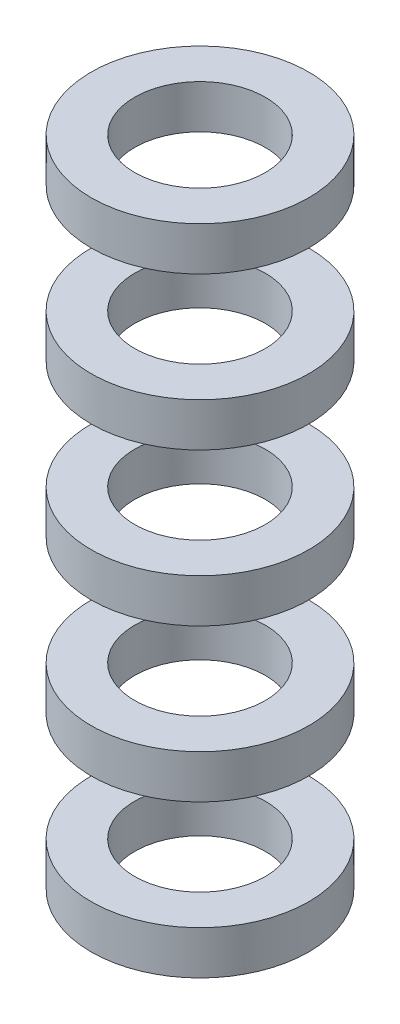
ISO-10303-21;
HEADER;
FILE_DESCRIPTION(('STEP AP214'),'2;1');
FILE_NAME('part.step','',(''),(''),'','','');
FILE_SCHEMA(('AUTOMOTIVE_DESIGN { 1 0 10303 214 1 1 1 1 }'));
ENDSEC;
DATA;
#1=APPLICATION_CONTEXT('core data for automotive mechanical design processes');
#2=APPLICATION_PROTOCOL_DEFINITION('international standard','automotive_design',2000,#1);
#3=PRODUCT_CONTEXT('',#1,'mechanical');
#4=PRODUCT('Part','Part','',(#3));
#5=PRODUCT_RELATED_PRODUCT_CATEGORY('part','',(#4));
#6=PRODUCT_DEFINITION_FORMATION('','',#4);
#7=PRODUCT_DEFINITION_CONTEXT('part definition',#1,'design');
#8=PRODUCT_DEFINITION('design','',#6,#7);
#9=PRODUCT_DEFINITION_SHAPE('','',#8);
#10=(LENGTH_UNIT() NAMED_UNIT(*) SI_UNIT(.MILLI.,.METRE.));
#11=(NAMED_UNIT(*) PLANE_ANGLE_UNIT() SI_UNIT($,.RADIAN.));
#12=(NAMED_UNIT(*) SI_UNIT($,.STERADIAN.) SOLID_ANGLE_UNIT());
#13=UNCERTAINTY_MEASURE_WITH_UNIT(LENGTH_MEASURE(1.E-05),#10,'distance_accuracy_value','');
#14=(GEOMETRIC_REPRESENTATION_CONTEXT(3) GLOBAL_UNCERTAINTY_ASSIGNED_CONTEXT((#13)) GLOBAL_UNIT_ASSIGNED_CONTEXT((#10,
#11,#12)) REPRESENTATION_CONTEXT('',''));
#15=CARTESIAN_POINT('',(0.,0.,0.));
#16=DIRECTION('',(0.,0.,1.));
#17=DIRECTION('',(1.,0.,0.));
#18=AXIS2_PLACEMENT_3D('',#15,#16,#17);
#19=CARTESIAN_POINT('',(0.,300.,0.));
#20=DIRECTION('',(0.,-1.,0.));
#21=DIRECTION('',(0.,0.,-1.));
#22=AXIS2_PLACEMENT_3D('',#19,#20,#21);
#23=CYLINDRICAL_SURFACE('',#22,50.);
#24=CARTESIAN_POINT('',(0.,20.,0.));
#25=DIRECTION('',(0.,-1.,0.));
#26=DIRECTION('',(1.,0.,0.));
#27=AXIS2_PLACEMENT_3D('',#24,#25,#26);
#28=CIRCLE('',#27,50.);
#29=CARTESIAN_POINT('',(50.,20.,0.));
#30=VERTEX_POINT('',#29);
#31=EDGE_CURVE('E45',#30,#30,#28,.T.);
#32=ORIENTED_EDGE('',*,*,#31,.T.);
#33=EDGE_LOOP('',(#32));
#34=FACE_BOUND('',#33,.T.);
#35=CARTESIAN_POINT('',(0.,0.,0.));
#36=DIRECTION('',(0.,1.,0.));
#37=DIRECTION('',(0.,0.,1.));
#38=AXIS2_PLACEMENT_3D('',#35,#36,#37);
#39=CIRCLE('',#38,50.);
#40=CARTESIAN_POINT('',(0.,0.,50.));
#41=VERTEX_POINT('',#40);
#42=EDGE_CURVE('E54',#41,#41,#39,.T.);
#43=ORIENTED_EDGE('',*,*,#42,.T.);
#44=EDGE_LOOP('',(#43));
#45=FACE_BOUND('',#44,.T.);
#46=ADVANCED_FACE('F42',(#34,#45),#23,.T.);
#47=CARTESIAN_POINT('',(0.,300.,0.));
#48=DIRECTION('',(0.,-1.,0.));
#49=DIRECTION('',(0.,0.,-1.));
#50=AXIS2_PLACEMENT_3D('',#47,#48,#49);
#51=CYLINDRICAL_SURFACE('',#50,30.);
#52=CARTESIAN_POINT('',(0.,20.,0.));
#53=DIRECTION('',(0.,-1.,0.));
#54=DIRECTION('',(1.,0.,0.));
#55=AXIS2_PLACEMENT_3D('',#52,#53,#54);
#56=CIRCLE('',#55,30.);
#57=CARTESIAN_POINT('',(30.,20.,0.));
#58=VERTEX_POINT('',#57);
#59=EDGE_CURVE('E11',#58,#58,#56,.T.);
#60=ORIENTED_EDGE('',*,*,#59,.F.);
#61=EDGE_LOOP('',(#60));
#62=FACE_BOUND('',#61,.T.);
#63=CARTESIAN_POINT('',(0.,0.,0.));
#64=DIRECTION('',(0.,1.,0.));
#65=DIRECTION('',(0.,0.,1.));
#66=AXIS2_PLACEMENT_3D('',#63,#64,#65);
#67=CIRCLE('',#66,30.);
#68=CARTESIAN_POINT('',(0.,0.,30.));
#69=VERTEX_POINT('',#68);
#70=EDGE_CURVE('E49',#69,#69,#67,.T.);
#71=ORIENTED_EDGE('',*,*,#70,.F.);
#72=EDGE_LOOP('',(#71));
#73=FACE_BOUND('',#72,.T.);
#74=ADVANCED_FACE('F70',(#62,#73),#51,.F.);
#75=CARTESIAN_POINT('',(0.,0.,0.));
#76=DIRECTION('',(0.,1.,0.));
#77=DIRECTION('',(0.,0.,1.));
#78=AXIS2_PLACEMENT_3D('',#75,#76,#77);
#79=PLANE('',#78);
#80=ORIENTED_EDGE('',*,*,#42,.F.);
#81=EDGE_LOOP('',(#80));
#82=FACE_BOUND('',#81,.T.);
#83=ORIENTED_EDGE('',*,*,#70,.T.);
#84=EDGE_LOOP('',(#83));
#85=FACE_BOUND('',#84,.T.);
#86=ADVANCED_FACE('F65',(#82,#85),#79,.F.);
#87=CARTESIAN_POINT('',(50.,20.,-250.));
#88=DIRECTION('',(0.,-1.,0.));
#89=DIRECTION('',(1.,0.,0.));
#90=AXIS2_PLACEMENT_3D('',#87,#88,#89);
#91=PLANE('',#90);
#92=ORIENTED_EDGE('',*,*,#59,.T.);
#93=EDGE_LOOP('',(#92));
#94=FACE_BOUND('',#93,.T.);
#95=ORIENTED_EDGE('',*,*,#31,.F.);
#96=EDGE_LOOP('',(#95));
#97=FACE_BOUND('',#96,.T.);
#98=ADVANCED_FACE('F63',(#94,#97),#91,.F.);
#99=CLOSED_SHELL('',(#46,#74,#86,#98));
#100=MANIFOLD_SOLID_BREP('B2',#99);
#101=CARTESIAN_POINT('',(0.,300.,0.));
#102=DIRECTION('',(0.,-1.,0.));
#103=DIRECTION('',(0.,0.,-1.));
#104=AXIS2_PLACEMENT_3D('',#101,#102,#103);
#105=CYLINDRICAL_SURFACE('',#104,30.);
#106=CARTESIAN_POINT('',(0.,70.,0.));
#107=DIRECTION('',(0.,1.,0.));
#108=DIRECTION('',(-1.,0.,0.));
#109=AXIS2_PLACEMENT_3D('',#106,#107,#108);
#110=CIRCLE('',#109,30.);
#111=CARTESIAN_POINT('',(-30.,70.,0.));
#112=VERTEX_POINT('',#111);
#113=EDGE_CURVE('E123',#112,#112,#110,.T.);
#114=ORIENTED_EDGE('',*,*,#113,.F.);
#115=EDGE_LOOP('',(#114));
#116=FACE_BOUND('',#115,.T.);
#117=CARTESIAN_POINT('',(0.,90.,0.));
#118=DIRECTION('',(0.,-1.,0.));
#119=DIRECTION('',(0.,0.,-1.));
#120=AXIS2_PLACEMENT_3D('',#117,#118,#119);
#121=CIRCLE('',#120,30.);
#122=CARTESIAN_POINT('',(0.,90.,-30.));
#123=VERTEX_POINT('',#122);
#124=EDGE_CURVE('E125',#123,#123,#121,.T.);
#125=ORIENTED_EDGE('',*,*,#124,.F.);
#126=EDGE_LOOP('',(#125));
#127=FACE_BOUND('',#126,.T.);
#128=ADVANCED_FACE('F112',(#116,#127),#105,.F.);
#129=CARTESIAN_POINT('',(-50.,90.,-250.));
#130=DIRECTION('',(0.,-1.,0.));
#131=DIRECTION('',(0.,0.,-1.));
#132=AXIS2_PLACEMENT_3D('',#129,#130,#131);
#133=PLANE('',#132);
#134=ORIENTED_EDGE('',*,*,#124,.T.);
#135=EDGE_LOOP('',(#134));
#136=FACE_BOUND('',#135,.T.);
#137=CARTESIAN_POINT('',(0.,90.,0.));
#138=DIRECTION('',(0.,-1.,0.));
#139=DIRECTION('',(0.,0.,-1.));
#140=AXIS2_PLACEMENT_3D('',#137,#138,#139);
#141=CIRCLE('',#140,50.);
#142=CARTESIAN_POINT('',(0.,90.,-50.));
#143=VERTEX_POINT('',#142);
#144=EDGE_CURVE('E116',#143,#143,#141,.T.);
#145=ORIENTED_EDGE('',*,*,#144,.F.);
#146=EDGE_LOOP('',(#145));
#147=FACE_BOUND('',#146,.T.);
#148=ADVANCED_FACE('F136',(#136,#147),#133,.F.);
#149=CARTESIAN_POINT('',(50.,70.,-250.));
#150=DIRECTION('',(0.,1.,0.));
#151=DIRECTION('',(-1.,0.,0.));
#152=AXIS2_PLACEMENT_3D('',#149,#150,#151);
#153=PLANE('',#152);
#154=ORIENTED_EDGE('',*,*,#113,.T.);
#155=EDGE_LOOP('',(#154));
#156=FACE_BOUND('',#155,.T.);
#157=CARTESIAN_POINT('',(0.,70.,0.));
#158=DIRECTION('',(0.,1.,0.));
#159=DIRECTION('',(-1.,0.,0.));
#160=AXIS2_PLACEMENT_3D('',#157,#158,#159);
#161=CIRCLE('',#160,50.);
#162=CARTESIAN_POINT('',(-50.,70.,0.));
#163=VERTEX_POINT('',#162);
#164=EDGE_CURVE('E41',#163,#163,#161,.T.);
#165=ORIENTED_EDGE('',*,*,#164,.F.);
#166=EDGE_LOOP('',(#165));
#167=FACE_BOUND('',#166,.T.);
#168=ADVANCED_FACE('F131',(#156,#167),#153,.F.);
#169=CARTESIAN_POINT('',(0.,300.,0.));
#170=DIRECTION('',(0.,-1.,0.));
#171=DIRECTION('',(0.,0.,-1.));
#172=AXIS2_PLACEMENT_3D('',#169,#170,#171);
#173=CYLINDRICAL_SURFACE('',#172,50.);
#174=ORIENTED_EDGE('',*,*,#144,.T.);
#175=EDGE_LOOP('',(#174));
#176=FACE_BOUND('',#175,.T.);
#177=ORIENTED_EDGE('',*,*,#164,.T.);
#178=EDGE_LOOP('',(#177));
#179=FACE_BOUND('',#178,.T.);
#180=ADVANCED_FACE('F114',(#176,#179),#173,.T.);
#181=CLOSED_SHELL('',(#128,#148,#168,#180));
#182=MANIFOLD_SOLID_BREP('B6',#181);
#183=CARTESIAN_POINT('',(0.,300.,0.));
#184=DIRECTION('',(0.,-1.,0.));
#185=DIRECTION('',(0.,0.,-1.));
#186=AXIS2_PLACEMENT_3D('',#183,#184,#185);
#187=CYLINDRICAL_SURFACE('',#186,30.);
#188=CARTESIAN_POINT('',(0.,160.,0.));
#189=DIRECTION('',(0.,-1.,0.));
#190=DIRECTION('',(0.,0.,-1.));
#191=AXIS2_PLACEMENT_3D('',#188,#189,#190);
#192=CIRCLE('',#191,30.);
#193=CARTESIAN_POINT('',(0.,160.,-30.));
#194=VERTEX_POINT('',#193);
#195=EDGE_CURVE('E193',#194,#194,#192,.T.);
#196=ORIENTED_EDGE('',*,*,#195,.F.);
#197=EDGE_LOOP('',(#196));
#198=FACE_BOUND('',#197,.T.);
#199=CARTESIAN_POINT('',(0.,140.,0.));
#200=DIRECTION('',(0.,1.,0.));
#201=DIRECTION('',(0.,0.,1.));
#202=AXIS2_PLACEMENT_3D('',#199,#200,#201);
#203=CIRCLE('',#202,30.);
#204=CARTESIAN_POINT('',(0.,140.,30.));
#205=VERTEX_POINT('',#204);
#206=EDGE_CURVE('E195',#205,#205,#203,.T.);
#207=ORIENTED_EDGE('',*,*,#206,.F.);
#208=EDGE_LOOP('',(#207));
#209=FACE_BOUND('',#208,.T.);
#210=ADVANCED_FACE('F182',(#198,#209),#187,.F.);
#211=CARTESIAN_POINT('',(50.,140.,-250.));
#212=DIRECTION('',(0.,1.,0.));
#213=DIRECTION('',(0.,0.,1.));
#214=AXIS2_PLACEMENT_3D('',#211,#212,#213);
#215=PLANE('',#214);
#216=ORIENTED_EDGE('',*,*,#206,.T.);
#217=EDGE_LOOP('',(#216));
#218=FACE_BOUND('',#217,.T.);
#219=CARTESIAN_POINT('',(0.,140.,0.));
#220=DIRECTION('',(0.,1.,0.));
#221=DIRECTION('',(0.,0.,1.));
#222=AXIS2_PLACEMENT_3D('',#219,#220,#221);
#223=CIRCLE('',#222,50.);
#224=CARTESIAN_POINT('',(0.,140.,50.));
#225=VERTEX_POINT('',#224);
#226=EDGE_CURVE('E186',#225,#225,#223,.T.);
#227=ORIENTED_EDGE('',*,*,#226,.F.);
#228=EDGE_LOOP('',(#227));
#229=FACE_BOUND('',#228,.T.);
#230=ADVANCED_FACE('F206',(#218,#229),#215,.F.);
#231=CARTESIAN_POINT('',(-50.,160.,-250.));
#232=DIRECTION('',(0.,-1.,0.));
#233=DIRECTION('',(0.,0.,-1.));
#234=AXIS2_PLACEMENT_3D('',#231,#232,#233);
#235=PLANE('',#234);
#236=ORIENTED_EDGE('',*,*,#195,.T.);
#237=EDGE_LOOP('',(#236));
#238=FACE_BOUND('',#237,.T.);
#239=CARTESIAN_POINT('',(0.,160.,0.));
#240=DIRECTION('',(0.,-1.,0.));
#241=DIRECTION('',(0.,0.,-1.));
#242=AXIS2_PLACEMENT_3D('',#239,#240,#241);
#243=CIRCLE('',#242,50.);
#244=CARTESIAN_POINT('',(0.,160.,-50.));
#245=VERTEX_POINT('',#244);
#246=EDGE_CURVE('E111',#245,#245,#243,.T.);
#247=ORIENTED_EDGE('',*,*,#246,.F.);
#248=EDGE_LOOP('',(#247));
#249=FACE_BOUND('',#248,.T.);
#250=ADVANCED_FACE('F201',(#238,#249),#235,.F.);
#251=CARTESIAN_POINT('',(0.,300.,0.));
#252=DIRECTION('',(0.,-1.,0.));
#253=DIRECTION('',(0.,0.,-1.));
#254=AXIS2_PLACEMENT_3D('',#251,#252,#253);
#255=CYLINDRICAL_SURFACE('',#254,50.);
#256=ORIENTED_EDGE('',*,*,#226,.T.);
#257=EDGE_LOOP('',(#256));
#258=FACE_BOUND('',#257,.T.);
#259=ORIENTED_EDGE('',*,*,#246,.T.);
#260=EDGE_LOOP('',(#259));
#261=FACE_BOUND('',#260,.T.);
#262=ADVANCED_FACE('F184',(#258,#261),#255,.T.);
#263=CLOSED_SHELL('',(#210,#230,#250,#262));
#264=MANIFOLD_SOLID_BREP('B36',#263);
#265=CARTESIAN_POINT('',(0.,300.,0.));
#266=DIRECTION('',(0.,-1.,0.));
#267=DIRECTION('',(0.,0.,-1.));
#268=AXIS2_PLACEMENT_3D('',#265,#266,#267);
#269=CYLINDRICAL_SURFACE('',#268,30.);
#270=CARTESIAN_POINT('',(0.,280.,0.));
#271=DIRECTION('',(0.,1.,0.));
#272=DIRECTION('',(0.,0.,1.));
#273=AXIS2_PLACEMENT_3D('',#270,#271,#272);
#274=CIRCLE('',#273,30.);
#275=CARTESIAN_POINT('',(0.,280.,30.));
#276=VERTEX_POINT('',#275);
#277=EDGE_CURVE('E181',#276,#276,#274,.T.);
#278=ORIENTED_EDGE('',*,*,#277,.F.);
#279=EDGE_LOOP('',(#278));
#280=FACE_BOUND('',#279,.T.);
#281=CARTESIAN_POINT('',(0.,300.,0.));
#282=DIRECTION('',(0.,1.,0.));
#283=DIRECTION('',(0.,0.,1.));
#284=AXIS2_PLACEMENT_3D('',#281,#282,#283);
#285=CIRCLE('',#284,30.);
#286=CARTESIAN_POINT('',(0.,300.,30.));
#287=VERTEX_POINT('',#286);
#288=EDGE_CURVE('E265',#287,#287,#285,.T.);
#289=ORIENTED_EDGE('',*,*,#288,.T.);
#290=EDGE_LOOP('',(#289));
#291=FACE_BOUND('',#290,.T.);
#292=ADVANCED_FACE('F251',(#280,#291),#269,.F.);
#293=CARTESIAN_POINT('',(0.,300.,0.));
#294=DIRECTION('',(0.,1.,0.));
#295=DIRECTION('',(0.,0.,1.));
#296=AXIS2_PLACEMENT_3D('',#293,#294,#295);
#297=PLANE('',#296);
#298=CARTESIAN_POINT('',(0.,300.,0.));
#299=DIRECTION('',(0.,1.,0.));
#300=DIRECTION('',(0.,0.,1.));
#301=AXIS2_PLACEMENT_3D('',#298,#299,#300);
#302=CIRCLE('',#301,50.);
#303=CARTESIAN_POINT('',(0.,300.,50.));
#304=VERTEX_POINT('',#303);
#305=EDGE_CURVE('E262',#304,#304,#302,.T.);
#306=ORIENTED_EDGE('',*,*,#305,.T.);
#307=EDGE_LOOP('',(#306));
#308=FACE_BOUND('',#307,.T.);
#309=ORIENTED_EDGE('',*,*,#288,.F.);
#310=EDGE_LOOP('',(#309));
#311=FACE_BOUND('',#310,.T.);
#312=ADVANCED_FACE('F270',(#308,#311),#297,.T.);
#313=CARTESIAN_POINT('',(0.,300.,0.));
#314=DIRECTION('',(0.,-1.,0.));
#315=DIRECTION('',(0.,0.,-1.));
#316=AXIS2_PLACEMENT_3D('',#313,#314,#315);
#317=CYLINDRICAL_SURFACE('',#316,50.);
#318=CARTESIAN_POINT('',(0.,280.,0.));
#319=DIRECTION('',(0.,1.,0.));
#320=DIRECTION('',(0.,0.,1.));
#321=AXIS2_PLACEMENT_3D('',#318,#319,#320);
#322=CIRCLE('',#321,50.);
#323=CARTESIAN_POINT('',(0.,280.,50.));
#324=VERTEX_POINT('',#323);
#325=EDGE_CURVE('E254',#324,#324,#322,.T.);
#326=ORIENTED_EDGE('',*,*,#325,.T.);
#327=EDGE_LOOP('',(#326));
#328=FACE_BOUND('',#327,.T.);
#329=ORIENTED_EDGE('',*,*,#305,.F.);
#330=EDGE_LOOP('',(#329));
#331=FACE_BOUND('',#330,.T.);
#332=ADVANCED_FACE('F272',(#328,#331),#317,.T.);
#333=CARTESIAN_POINT('',(-50.,280.,-250.));
#334=DIRECTION('',(0.,1.,0.));
#335=DIRECTION('',(0.,0.,1.));
#336=AXIS2_PLACEMENT_3D('',#333,#334,#335);
#337=PLANE('',#336);
#338=ORIENTED_EDGE('',*,*,#277,.T.);
#339=EDGE_LOOP('',(#338));
#340=FACE_BOUND('',#339,.T.);
#341=ORIENTED_EDGE('',*,*,#325,.F.);
#342=EDGE_LOOP('',(#341));
#343=FACE_BOUND('',#342,.T.);
#344=ADVANCED_FACE('F279',(#340,#343),#337,.F.);
#345=CLOSED_SHELL('',(#292,#312,#332,#344));
#346=MANIFOLD_SOLID_BREP('B106',#345);
#347=CARTESIAN_POINT('',(0.,300.,0.));
#348=DIRECTION('',(0.,-1.,0.));
#349=DIRECTION('',(0.,0.,-1.));
#350=AXIS2_PLACEMENT_3D('',#347,#348,#349);
#351=CYLINDRICAL_SURFACE('',#350,50.);
#352=CARTESIAN_POINT('',(0.,210.,0.));
#353=DIRECTION('',(0.,1.,0.));
#354=DIRECTION('',(0.,0.,1.));
#355=AXIS2_PLACEMENT_3D('',#352,#353,#354);
#356=CIRCLE('',#355,50.);
#357=CARTESIAN_POINT('',(0.,210.,50.));
#358=VERTEX_POINT('',#357);
#359=EDGE_CURVE('E325',#358,#358,#356,.T.);
#360=ORIENTED_EDGE('',*,*,#359,.T.);
#361=EDGE_LOOP('',(#360));
#362=FACE_BOUND('',#361,.T.);
#363=CARTESIAN_POINT('',(0.,230.,0.));
#364=DIRECTION('',(0.,-1.,0.));
#365=DIRECTION('',(0.,0.,-1.));
#366=AXIS2_PLACEMENT_3D('',#363,#364,#365);
#367=CIRCLE('',#366,50.);
#368=CARTESIAN_POINT('',(0.,230.,-50.));
#369=VERTEX_POINT('',#368);
#370=EDGE_CURVE('E250',#369,#369,#367,.T.);
#371=ORIENTED_EDGE('',*,*,#370,.T.);
#372=EDGE_LOOP('',(#371));
#373=FACE_BOUND('',#372,.T.);
#374=ADVANCED_FACE('F313',(#362,#373),#351,.T.);
#375=CARTESIAN_POINT('',(-50.,230.,-250.));
#376=DIRECTION('',(0.,-1.,0.));
#377=DIRECTION('',(0.,0.,-1.));
#378=AXIS2_PLACEMENT_3D('',#375,#376,#377);
#379=PLANE('',#378);
#380=CARTESIAN_POINT('',(0.,230.,0.));
#381=DIRECTION('',(0.,-1.,0.));
#382=DIRECTION('',(0.,0.,-1.));
#383=AXIS2_PLACEMENT_3D('',#380,#381,#382);
#384=CIRCLE('',#383,30.);
#385=CARTESIAN_POINT('',(0.,230.,-30.));
#386=VERTEX_POINT('',#385);
#387=EDGE_CURVE('E320',#386,#386,#384,.T.);
#388=ORIENTED_EDGE('',*,*,#387,.T.);
#389=EDGE_LOOP('',(#388));
#390=FACE_BOUND('',#389,.T.);
#391=ORIENTED_EDGE('',*,*,#370,.F.);
#392=EDGE_LOOP('',(#391));
#393=FACE_BOUND('',#392,.T.);
#394=ADVANCED_FACE('F339',(#390,#393),#379,.F.);
#395=CARTESIAN_POINT('',(0.,300.,0.));
#396=DIRECTION('',(0.,-1.,0.));
#397=DIRECTION('',(0.,0.,-1.));
#398=AXIS2_PLACEMENT_3D('',#395,#396,#397);
#399=CYLINDRICAL_SURFACE('',#398,30.);
#400=CARTESIAN_POINT('',(0.,210.,0.));
#401=DIRECTION('',(0.,1.,0.));
#402=DIRECTION('',(0.,0.,1.));
#403=AXIS2_PLACEMENT_3D('',#400,#401,#402);
#404=CIRCLE('',#403,30.);
#405=CARTESIAN_POINT('',(0.,210.,30.));
#406=VERTEX_POINT('',#405);
#407=EDGE_CURVE('E316',#406,#406,#404,.T.);
#408=ORIENTED_EDGE('',*,*,#407,.F.);
#409=EDGE_LOOP('',(#408));
#410=FACE_BOUND('',#409,.T.);
#411=ORIENTED_EDGE('',*,*,#387,.F.);
#412=EDGE_LOOP('',(#411));
#413=FACE_BOUND('',#412,.T.);
#414=ADVANCED_FACE('F336',(#410,#413),#399,.F.);
#415=CARTESIAN_POINT('',(-50.,210.,-250.));
#416=DIRECTION('',(0.,1.,0.));
#417=DIRECTION('',(0.,0.,1.));
#418=AXIS2_PLACEMENT_3D('',#415,#416,#417);
#419=PLANE('',#418);
#420=ORIENTED_EDGE('',*,*,#407,.T.);
#421=EDGE_LOOP('',(#420));
#422=FACE_BOUND('',#421,.T.);
#423=ORIENTED_EDGE('',*,*,#359,.F.);
#424=EDGE_LOOP('',(#423));
#425=FACE_BOUND('',#424,.T.);
#426=ADVANCED_FACE('F333',(#422,#425),#419,.F.);
#427=CLOSED_SHELL('',(#374,#394,#414,#426));
#428=MANIFOLD_SOLID_BREP('B176',#427);
#429=ADVANCED_BREP_SHAPE_REPRESENTATION('',(#18,#100,#182,#264,#346,#428),#14);
#430=SHAPE_DEFINITION_REPRESENTATION(#9,#429);
ENDSEC;
END-ISO-10303-21;
